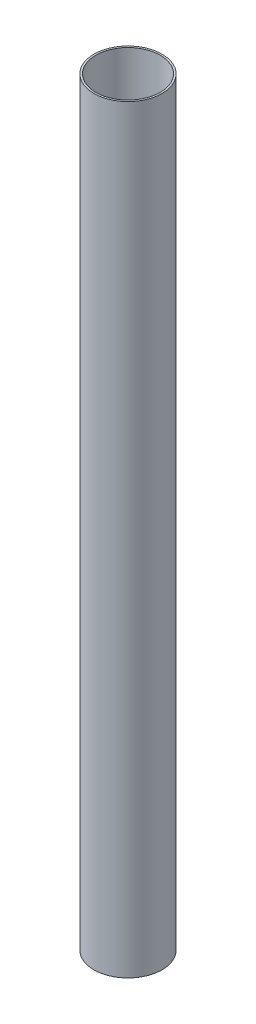
ISO-10303-21;
HEADER;
FILE_DESCRIPTION(('STEP AP214'),'2;1');
FILE_NAME('part.step','',(''),(''),'','','');
FILE_SCHEMA(('AUTOMOTIVE_DESIGN { 1 0 10303 214 1 1 1 1 }'));
ENDSEC;
DATA;
#1=APPLICATION_CONTEXT('core data for automotive mechanical design processes');
#2=APPLICATION_PROTOCOL_DEFINITION('international standard','automotive_design',2000,#1);
#3=PRODUCT_CONTEXT('',#1,'mechanical');
#4=PRODUCT('Part','Part','',(#3));
#5=PRODUCT_RELATED_PRODUCT_CATEGORY('part','',(#4));
#6=PRODUCT_DEFINITION_FORMATION('','',#4);
#7=PRODUCT_DEFINITION_CONTEXT('part definition',#1,'design');
#8=PRODUCT_DEFINITION('design','',#6,#7);
#9=PRODUCT_DEFINITION_SHAPE('','',#8);
#10=(LENGTH_UNIT() NAMED_UNIT(*) SI_UNIT(.MILLI.,.METRE.));
#11=(NAMED_UNIT(*) PLANE_ANGLE_UNIT() SI_UNIT($,.RADIAN.));
#12=(NAMED_UNIT(*) SI_UNIT($,.STERADIAN.) SOLID_ANGLE_UNIT());
#13=UNCERTAINTY_MEASURE_WITH_UNIT(LENGTH_MEASURE(1.E-05),#10,'distance_accuracy_value','');
#14=(GEOMETRIC_REPRESENTATION_CONTEXT(3) GLOBAL_UNCERTAINTY_ASSIGNED_CONTEXT((#13)) GLOBAL_UNIT_ASSIGNED_CONTEXT((#10,
#11,#12)) REPRESENTATION_CONTEXT('',''));
#15=CARTESIAN_POINT('',(0.,0.,0.));
#16=DIRECTION('',(0.,0.,1.));
#17=DIRECTION('',(1.,0.,0.));
#18=AXIS2_PLACEMENT_3D('',#15,#16,#17);
#19=CARTESIAN_POINT('',(0.,560.9336,0.));
#20=DIRECTION('',(0.,1.,0.));
#21=DIRECTION('',(0.,0.,1.));
#22=AXIS2_PLACEMENT_3D('',#19,#20,#21);
#23=PLANE('',#22);
#24=CARTESIAN_POINT('',(0.,560.9336,0.));
#25=DIRECTION('',(0.,1.,0.));
#26=DIRECTION('',(0.,0.,1.));
#27=AXIS2_PLACEMENT_3D('',#24,#25,#26);
#28=CIRCLE('',#27,25.1714);
#29=CARTESIAN_POINT('',(0.,560.9336,25.1714));
#30=VERTEX_POINT('',#29);
#31=EDGE_CURVE('E10',#30,#30,#28,.T.);
#32=ORIENTED_EDGE('',*,*,#31,.T.);
#33=EDGE_LOOP('',(#32));
#34=FACE_BOUND('',#33,.T.);
#35=CARTESIAN_POINT('',(0.,560.9336,0.));
#36=DIRECTION('',(0.,1.,0.));
#37=DIRECTION('',(0.,0.,1.));
#38=AXIS2_PLACEMENT_3D('',#35,#36,#37);
#39=CIRCLE('',#38,23.8125);
#40=CARTESIAN_POINT('',(0.,560.9336,23.8125));
#41=VERTEX_POINT('',#40);
#42=EDGE_CURVE('E48',#41,#41,#39,.T.);
#43=ORIENTED_EDGE('',*,*,#42,.F.);
#44=EDGE_LOOP('',(#43));
#45=FACE_BOUND('',#44,.T.);
#46=ADVANCED_FACE('F37',(#34,#45),#23,.T.);
#47=CARTESIAN_POINT('',(0.,0.,0.));
#48=DIRECTION('',(0.,1.,0.));
#49=DIRECTION('',(0.,0.,1.));
#50=AXIS2_PLACEMENT_3D('',#47,#48,#49);
#51=PLANE('',#50);
#52=CARTESIAN_POINT('',(0.,0.,0.));
#53=DIRECTION('',(0.,1.,0.));
#54=DIRECTION('',(0.,0.,1.));
#55=AXIS2_PLACEMENT_3D('',#52,#53,#54);
#56=CIRCLE('',#55,25.1714);
#57=CARTESIAN_POINT('',(0.,0.,25.1714));
#58=VERTEX_POINT('',#57);
#59=EDGE_CURVE('E41',#58,#58,#56,.T.);
#60=ORIENTED_EDGE('',*,*,#59,.F.);
#61=EDGE_LOOP('',(#60));
#62=FACE_BOUND('',#61,.T.);
#63=CARTESIAN_POINT('',(0.,0.,0.));
#64=DIRECTION('',(0.,1.,0.));
#65=DIRECTION('',(0.,0.,1.));
#66=AXIS2_PLACEMENT_3D('',#63,#64,#65);
#67=CIRCLE('',#66,23.8125);
#68=CARTESIAN_POINT('',(0.,0.,23.8125));
#69=VERTEX_POINT('',#68);
#70=EDGE_CURVE('E50',#69,#69,#67,.T.);
#71=ORIENTED_EDGE('',*,*,#70,.T.);
#72=EDGE_LOOP('',(#71));
#73=FACE_BOUND('',#72,.T.);
#74=ADVANCED_FACE('F60',(#62,#73),#51,.F.);
#75=CARTESIAN_POINT('',(0.,560.9336,0.));
#76=DIRECTION('',(0.,-1.,0.));
#77=DIRECTION('',(0.,0.,-1.));
#78=AXIS2_PLACEMENT_3D('',#75,#76,#77);
#79=CYLINDRICAL_SURFACE('',#78,25.1714);
#80=ORIENTED_EDGE('',*,*,#31,.F.);
#81=EDGE_LOOP('',(#80));
#82=FACE_BOUND('',#81,.T.);
#83=ORIENTED_EDGE('',*,*,#59,.T.);
#84=EDGE_LOOP('',(#83));
#85=FACE_BOUND('',#84,.T.);
#86=ADVANCED_FACE('F39',(#82,#85),#79,.T.);
#87=CARTESIAN_POINT('',(0.,560.9336,0.));
#88=DIRECTION('',(0.,-1.,0.));
#89=DIRECTION('',(0.,0.,-1.));
#90=AXIS2_PLACEMENT_3D('',#87,#88,#89);
#91=CYLINDRICAL_SURFACE('',#90,23.8125);
#92=ORIENTED_EDGE('',*,*,#42,.T.);
#93=EDGE_LOOP('',(#92));
#94=FACE_BOUND('',#93,.T.);
#95=ORIENTED_EDGE('',*,*,#70,.F.);
#96=EDGE_LOOP('',(#95));
#97=FACE_BOUND('',#96,.T.);
#98=ADVANCED_FACE('F56',(#94,#97),#91,.F.);
#99=CLOSED_SHELL('',(#46,#74,#86,#98));
#100=MANIFOLD_SOLID_BREP('B2',#99);
#101=ADVANCED_BREP_SHAPE_REPRESENTATION('',(#18,#100),#14);
#102=SHAPE_DEFINITION_REPRESENTATION(#9,#101);
ENDSEC;
END-ISO-10303-21;
